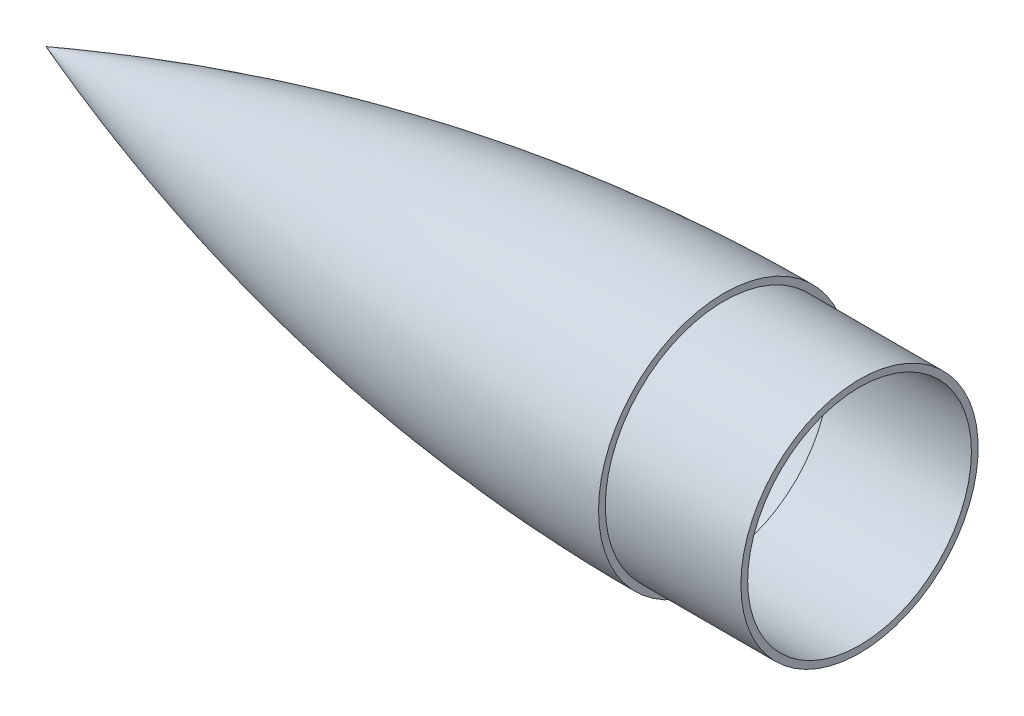
ISO-10303-21;
HEADER;
FILE_DESCRIPTION(('STEP AP214'),'2;1');
FILE_NAME('part.step','',(''),(''),'','','');
FILE_SCHEMA(('AUTOMOTIVE_DESIGN { 1 0 10303 214 1 1 1 1 }'));
ENDSEC;
DATA;
#1=APPLICATION_CONTEXT('core data for automotive mechanical design processes');
#2=APPLICATION_PROTOCOL_DEFINITION('international standard','automotive_design',2000,#1);
#3=PRODUCT_CONTEXT('',#1,'mechanical');
#4=PRODUCT('Part','Part','',(#3));
#5=PRODUCT_RELATED_PRODUCT_CATEGORY('part','',(#4));
#6=PRODUCT_DEFINITION_FORMATION('','',#4);
#7=PRODUCT_DEFINITION_CONTEXT('part definition',#1,'design');
#8=PRODUCT_DEFINITION('design','',#6,#7);
#9=PRODUCT_DEFINITION_SHAPE('','',#8);
#10=(LENGTH_UNIT() NAMED_UNIT(*) SI_UNIT(.MILLI.,.METRE.));
#11=(NAMED_UNIT(*) PLANE_ANGLE_UNIT() SI_UNIT($,.RADIAN.));
#12=(NAMED_UNIT(*) SI_UNIT($,.STERADIAN.) SOLID_ANGLE_UNIT());
#13=UNCERTAINTY_MEASURE_WITH_UNIT(LENGTH_MEASURE(1.E-05),#10,'distance_accuracy_value','');
#14=(GEOMETRIC_REPRESENTATION_CONTEXT(3) GLOBAL_UNCERTAINTY_ASSIGNED_CONTEXT((#13)) GLOBAL_UNIT_ASSIGNED_CONTEXT((#10,
#11,#12)) REPRESENTATION_CONTEXT('',''));
#15=CARTESIAN_POINT('',(0.,0.,0.));
#16=DIRECTION('',(0.,0.,1.));
#17=DIRECTION('',(1.,0.,0.));
#18=AXIS2_PLACEMENT_3D('',#15,#16,#17);
#19=CARTESIAN_POINT('',(0.,0.,0.));
#20=DIRECTION('',(-1.,0.,0.));
#21=DIRECTION('',(0.,0.,1.));
#22=AXIS2_PLACEMENT_3D('',#19,#20,#21);
#23=CYLINDRICAL_SURFACE('',#22,69.9999999985758);
#24=CARTESIAN_POINT('',(399.999999999535,0.,0.));
#25=DIRECTION('',(-1.,0.,0.));
#26=DIRECTION('',(0.,0.,1.));
#27=AXIS2_PLACEMENT_3D('',#24,#25,#26);
#28=CIRCLE('',#27,69.9999999985758);
#29=CARTESIAN_POINT('',(399.999999999535,0.,69.9999999985758));
#30=VERTEX_POINT('',#29);
#31=EDGE_CURVE('E11',#30,#30,#28,.T.);
#32=ORIENTED_EDGE('',*,*,#31,.F.);
#33=EDGE_LOOP('',(#32));
#34=FACE_BOUND('',#33,.T.);
#35=CARTESIAN_POINT('',(479.999999999535,0.,0.));
#36=DIRECTION('',(-1.,0.,0.));
#37=DIRECTION('',(0.,0.,1.));
#38=AXIS2_PLACEMENT_3D('',#35,#36,#37);
#39=CIRCLE('',#38,69.9999999985758);
#40=CARTESIAN_POINT('',(479.999999999535,0.,69.9999999985758));
#41=VERTEX_POINT('',#40);
#42=EDGE_CURVE('E69',#41,#41,#39,.T.);
#43=ORIENTED_EDGE('',*,*,#42,.T.);
#44=EDGE_LOOP('',(#43));
#45=FACE_BOUND('',#44,.T.);
#46=ADVANCED_FACE('F39',(#34,#45),#23,.T.);
#47=CARTESIAN_POINT('',(399.999999999536,69.9999999985758,0.));
#48=DIRECTION('',(-1.,0.,0.));
#49=DIRECTION('',(0.,0.,1.));
#50=AXIS2_PLACEMENT_3D('',#47,#48,#49);
#51=PLANE('',#50);
#52=CARTESIAN_POINT('',(399.999999999536,0.,0.));
#53=DIRECTION('',(-1.,0.,0.));
#54=DIRECTION('',(0.,0.,1.));
#55=AXIS2_PLACEMENT_3D('',#52,#53,#54);
#56=CIRCLE('',#55,73.9999999985758);
#57=CARTESIAN_POINT('',(399.999999999536,0.,73.9999999985758));
#58=VERTEX_POINT('',#57);
#59=EDGE_CURVE('E47',#58,#58,#56,.T.);
#60=ORIENTED_EDGE('',*,*,#59,.F.);
#61=EDGE_LOOP('',(#60));
#62=FACE_BOUND('',#61,.T.);
#63=ORIENTED_EDGE('',*,*,#31,.T.);
#64=EDGE_LOOP('',(#63));
#65=FACE_BOUND('',#64,.T.);
#66=ADVANCED_FACE('F96',(#62,#65),#51,.F.);
#67=CARTESIAN_POINT('',(399.999999999433,74.,0.));
#68=CARTESIAN_POINT('',(199.999999999704,73.9999999998951,0.));
#69=CARTESIAN_POINT('',(-2.52124709998469E-11,-9.3267407685893E-12,0.));
#70=B_SPLINE_CURVE_WITH_KNOTS('',2,(#67,#68,#69),.UNSPECIFIED.,.F.,.F.,(3,3),
(0.0799368856910513,0.91635789869801),.UNSPECIFIED.);
#71=CARTESIAN_POINT('',(0.,0.,0.));
#72=DIRECTION('',(-1.,0.,0.));
#73=AXIS1_PLACEMENT('',#71,#72);
#74=SURFACE_OF_REVOLUTION('',#70,#73);
#75=CARTESIAN_POINT('',(-2.52124709998469E-11,-9.3267407685893E-12,0.));
#76=VERTEX_POINT('',#75);
#77=VERTEX_LOOP('',#76);
#78=FACE_BOUND('',#77,.T.);
#79=ORIENTED_EDGE('',*,*,#59,.T.);
#80=EDGE_LOOP('',(#79));
#81=FACE_BOUND('',#80,.T.);
#82=ADVANCED_FACE('F93',(#78,#81),#74,.T.);
#83=CARTESIAN_POINT('',(479.999999999535,69.9999999985758,0.));
#84=DIRECTION('',(-1.,0.,0.));
#85=DIRECTION('',(0.,0.,1.));
#86=AXIS2_PLACEMENT_3D('',#83,#84,#85);
#87=PLANE('',#86);
#88=CARTESIAN_POINT('',(479.999999999535,0.,0.));
#89=DIRECTION('',(-1.,0.,0.));
#90=DIRECTION('',(0.,0.,1.));
#91=AXIS2_PLACEMENT_3D('',#88,#89,#90);
#92=CIRCLE('',#91,65.9999999985758);
#93=CARTESIAN_POINT('',(479.999999999535,0.,65.9999999985758));
#94=VERTEX_POINT('',#93);
#95=EDGE_CURVE('E64',#94,#94,#92,.T.);
#96=ORIENTED_EDGE('',*,*,#95,.T.);
#97=EDGE_LOOP('',(#96));
#98=FACE_BOUND('',#97,.T.);
#99=ORIENTED_EDGE('',*,*,#42,.F.);
#100=EDGE_LOOP('',(#99));
#101=FACE_BOUND('',#100,.T.);
#102=ADVANCED_FACE('F89',(#98,#101),#87,.F.);
#103=CARTESIAN_POINT('',(0.,0.,0.));
#104=DIRECTION('',(-1.,0.,0.));
#105=DIRECTION('',(0.,0.,1.));
#106=AXIS2_PLACEMENT_3D('',#103,#104,#105);
#107=CYLINDRICAL_SURFACE('',#106,65.9999999985758);
#108=CARTESIAN_POINT('',(395.999999999535,0.,0.));
#109=DIRECTION('',(-1.,0.,0.));
#110=DIRECTION('',(0.,0.,1.));
#111=AXIS2_PLACEMENT_3D('',#108,#109,#110);
#112=CIRCLE('',#111,65.9999999985758);
#113=CARTESIAN_POINT('',(395.999999999535,0.,65.9999999985758));
#114=VERTEX_POINT('',#113);
#115=EDGE_CURVE('E63',#114,#114,#112,.T.);
#116=ORIENTED_EDGE('',*,*,#115,.T.);
#117=EDGE_LOOP('',(#116));
#118=FACE_BOUND('',#117,.T.);
#119=ORIENTED_EDGE('',*,*,#95,.F.);
#120=EDGE_LOOP('',(#119));
#121=FACE_BOUND('',#120,.T.);
#122=ADVANCED_FACE('F92',(#118,#121),#107,.F.);
#123=CARTESIAN_POINT('',(395.999999999535,69.9999999985758,0.));
#124=DIRECTION('',(-1.,0.,0.));
#125=DIRECTION('',(0.,0.,1.));
#126=AXIS2_PLACEMENT_3D('',#123,#124,#125);
#127=PLANE('',#126);
#128=CARTESIAN_POINT('',(395.999999999536,0.,0.));
#129=DIRECTION('',(-1.,0.,0.));
#130=DIRECTION('',(0.,0.,1.));
#131=AXIS2_PLACEMENT_3D('',#128,#129,#130);
#132=CIRCLE('',#131,69.9925725184112);
#133=CARTESIAN_POINT('',(395.999999999536,0.,69.9925725184112));
#134=VERTEX_POINT('',#133);
#135=EDGE_CURVE('E60',#134,#134,#132,.T.);
#136=ORIENTED_EDGE('',*,*,#135,.T.);
#137=EDGE_LOOP('',(#136));
#138=FACE_BOUND('',#137,.T.);
#139=ORIENTED_EDGE('',*,*,#115,.F.);
#140=EDGE_LOOP('',(#139));
#141=FACE_BOUND('',#140,.T.);
#142=ADVANCED_FACE('F56',(#138,#141),#127,.T.);
#143=CARTESIAN_POINT('',(399.999999999433,74.,0.));
#144=CARTESIAN_POINT('',(205.151459949608,73.9999999998978,0.));
#145=CARTESIAN_POINT('',(10.3029198997824,3.76298591463113,0.));
#146=B_SPLINE_CURVE_WITH_KNOTS('',2,(#143,#144,#145),.UNSPECIFIED.,.F.,.F.,(3,3),
(0.0799368856910513,0.894813951949164),.UNSPECIFIED.);
#147=CARTESIAN_POINT('',(0.,0.,0.));
#148=DIRECTION('',(-1.,0.,0.));
#149=AXIS1_PLACEMENT('',#147,#148);
#150=SURFACE_OF_REVOLUTION('',#146,#149);
#151=OFFSET_SURFACE('',#150,-4.,.F.);
#152=CARTESIAN_POINT('',(11.6593626764182,0.,0.));
#153=VERTEX_POINT('',#152);
#154=VERTEX_LOOP('',#153);
#155=FACE_BOUND('',#154,.T.);
#156=ORIENTED_EDGE('',*,*,#135,.F.);
#157=EDGE_LOOP('',(#156));
#158=FACE_BOUND('',#157,.T.);
#159=ADVANCED_FACE('F53',(#155,#158),#151,.F.);
#160=CLOSED_SHELL('',(#46,#66,#82,#102,#122,#142,#159));
#161=MANIFOLD_SOLID_BREP('B2',#160);
#162=ADVANCED_BREP_SHAPE_REPRESENTATION('',(#18,#161),#14);
#163=SHAPE_DEFINITION_REPRESENTATION(#9,#162);
ENDSEC;
END-ISO-10303-21;
